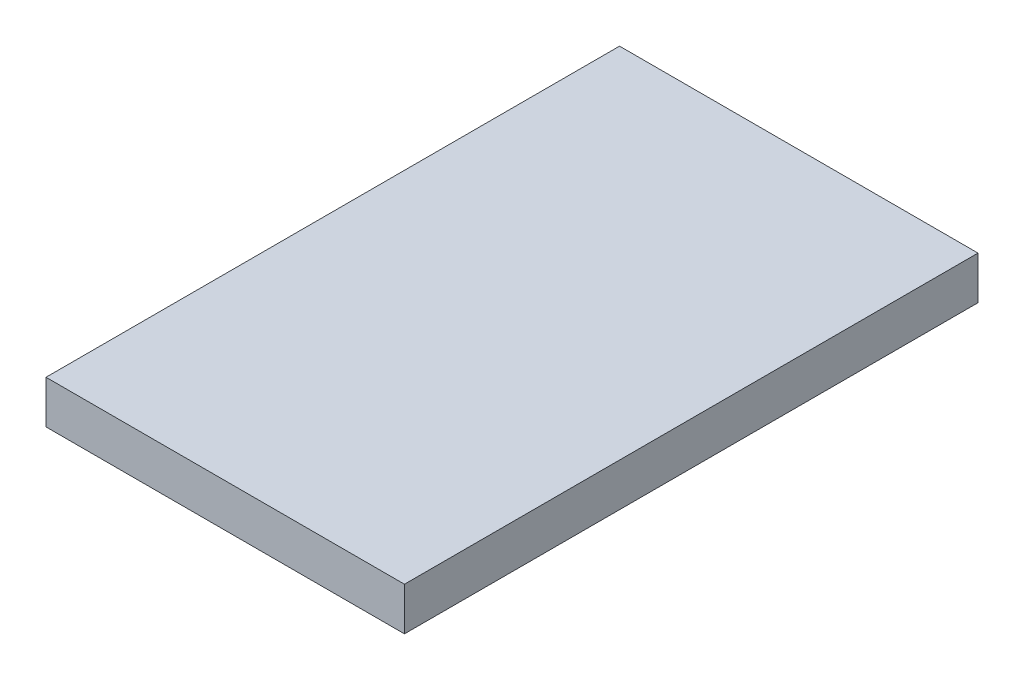
ISO-10303-21;
HEADER;
FILE_DESCRIPTION(('STEP AP214'),'2;1');
FILE_NAME('part.step','',(''),(''),'','','');
FILE_SCHEMA(('AUTOMOTIVE_DESIGN { 1 0 10303 214 1 1 1 1 }'));
ENDSEC;
DATA;
#1=APPLICATION_CONTEXT('core data for automotive mechanical design processes');
#2=APPLICATION_PROTOCOL_DEFINITION('international standard','automotive_design',2000,#1);
#3=PRODUCT_CONTEXT('',#1,'mechanical');
#4=PRODUCT('Part','Part','',(#3));
#5=PRODUCT_RELATED_PRODUCT_CATEGORY('part','',(#4));
#6=PRODUCT_DEFINITION_FORMATION('','',#4);
#7=PRODUCT_DEFINITION_CONTEXT('part definition',#1,'design');
#8=PRODUCT_DEFINITION('design','',#6,#7);
#9=PRODUCT_DEFINITION_SHAPE('','',#8);
#10=(LENGTH_UNIT() NAMED_UNIT(*) SI_UNIT(.MILLI.,.METRE.));
#11=(NAMED_UNIT(*) PLANE_ANGLE_UNIT() SI_UNIT($,.RADIAN.));
#12=(NAMED_UNIT(*) SI_UNIT($,.STERADIAN.) SOLID_ANGLE_UNIT());
#13=UNCERTAINTY_MEASURE_WITH_UNIT(LENGTH_MEASURE(1.E-05),#10,'distance_accuracy_value','');
#14=(GEOMETRIC_REPRESENTATION_CONTEXT(3) GLOBAL_UNCERTAINTY_ASSIGNED_CONTEXT((#13)) GLOBAL_UNIT_ASSIGNED_CONTEXT((#10,
#11,#12)) REPRESENTATION_CONTEXT('',''));
#15=CARTESIAN_POINT('',(0.,0.,0.));
#16=DIRECTION('',(0.,0.,1.));
#17=DIRECTION('',(1.,0.,0.));
#18=AXIS2_PLACEMENT_3D('',#15,#16,#17);
#19=CARTESIAN_POINT('',(12.5,3.,-20.));
#20=DIRECTION('',(-1.,0.,0.));
#21=DIRECTION('',(0.,0.,1.));
#22=AXIS2_PLACEMENT_3D('',#19,#20,#21);
#23=PLANE('',#22);
#24=DIRECTION('',(0.,0.,-1.));
#25=VECTOR('',#24,1.);
#26=CARTESIAN_POINT('',(12.5,0.,-20.));
#27=LINE('',#26,#25);
#28=CARTESIAN_POINT('',(12.5,0.,20.));
#29=VERTEX_POINT('',#28);
#30=CARTESIAN_POINT('',(12.5,0.,-20.));
#31=VERTEX_POINT('',#30);
#32=EDGE_CURVE('E96',#29,#31,#27,.T.);
#33=ORIENTED_EDGE('',*,*,#32,.T.);
#34=DIRECTION('',(0.,-1.,0.));
#35=VECTOR('',#34,1.);
#36=CARTESIAN_POINT('',(12.5,3.,-20.));
#37=LINE('',#36,#35);
#38=CARTESIAN_POINT('',(12.5,3.,-20.));
#39=VERTEX_POINT('',#38);
#40=EDGE_CURVE('E11',#39,#31,#37,.T.);
#41=ORIENTED_EDGE('',*,*,#40,.F.);
#42=DIRECTION('',(0.,0.,-1.));
#43=VECTOR('',#42,1.);
#44=CARTESIAN_POINT('',(12.5,3.,-20.));
#45=LINE('',#44,#43);
#46=CARTESIAN_POINT('',(12.5,3.,20.));
#47=VERTEX_POINT('',#46);
#48=EDGE_CURVE('E84',#47,#39,#45,.T.);
#49=ORIENTED_EDGE('',*,*,#48,.F.);
#50=DIRECTION('',(0.,-1.,0.));
#51=VECTOR('',#50,1.);
#52=CARTESIAN_POINT('',(12.5,3.,20.));
#53=LINE('',#52,#51);
#54=EDGE_CURVE('E92',#47,#29,#53,.T.);
#55=ORIENTED_EDGE('',*,*,#54,.T.);
#56=EDGE_LOOP('',(#33,#41,#49,#55));
#57=FACE_BOUND('',#56,.T.);
#58=ADVANCED_FACE('F33',(#57),#23,.F.);
#59=CARTESIAN_POINT('',(-12.5,3.,-20.));
#60=DIRECTION('',(0.,0.,1.));
#61=DIRECTION('',(1.,0.,0.));
#62=AXIS2_PLACEMENT_3D('',#59,#60,#61);
#63=PLANE('',#62);
#64=DIRECTION('',(-1.,0.,0.));
#65=VECTOR('',#64,1.);
#66=CARTESIAN_POINT('',(-12.5,0.,-20.));
#67=LINE('',#66,#65);
#68=CARTESIAN_POINT('',(-12.5,0.,-20.));
#69=VERTEX_POINT('',#68);
#70=EDGE_CURVE('E88',#31,#69,#67,.T.);
#71=ORIENTED_EDGE('',*,*,#70,.T.);
#72=DIRECTION('',(0.,-1.,0.));
#73=VECTOR('',#72,1.);
#74=CARTESIAN_POINT('',(-12.5,3.,-20.));
#75=LINE('',#74,#73);
#76=CARTESIAN_POINT('',(-12.5,3.,-20.));
#77=VERTEX_POINT('',#76);
#78=EDGE_CURVE('E41',#77,#69,#75,.T.);
#79=ORIENTED_EDGE('',*,*,#78,.F.);
#80=DIRECTION('',(-1.,0.,0.));
#81=VECTOR('',#80,1.);
#82=CARTESIAN_POINT('',(-12.5,3.,-20.));
#83=LINE('',#82,#81);
#84=EDGE_CURVE('E79',#39,#77,#83,.T.);
#85=ORIENTED_EDGE('',*,*,#84,.F.);
#86=ORIENTED_EDGE('',*,*,#40,.T.);
#87=EDGE_LOOP('',(#71,#79,#85,#86));
#88=FACE_BOUND('',#87,.T.);
#89=ADVANCED_FACE('F87',(#88),#63,.F.);
#90=CARTESIAN_POINT('',(-12.5,3.,-20.));
#91=DIRECTION('',(1.,0.,0.));
#92=DIRECTION('',(0.,0.,-1.));
#93=AXIS2_PLACEMENT_3D('',#90,#91,#92);
#94=PLANE('',#93);
#95=DIRECTION('',(0.,0.,1.));
#96=VECTOR('',#95,1.);
#97=CARTESIAN_POINT('',(-12.5,0.,-20.));
#98=LINE('',#97,#96);
#99=CARTESIAN_POINT('',(-12.5,0.,20.));
#100=VERTEX_POINT('',#99);
#101=EDGE_CURVE('E66',#69,#100,#98,.T.);
#102=ORIENTED_EDGE('',*,*,#101,.T.);
#103=DIRECTION('',(0.,-1.,0.));
#104=VECTOR('',#103,1.);
#105=CARTESIAN_POINT('',(-12.5,3.,20.));
#106=LINE('',#105,#104);
#107=CARTESIAN_POINT('',(-12.5,3.,20.));
#108=VERTEX_POINT('',#107);
#109=EDGE_CURVE('E89',#108,#100,#106,.T.);
#110=ORIENTED_EDGE('',*,*,#109,.F.);
#111=DIRECTION('',(0.,0.,1.));
#112=VECTOR('',#111,1.);
#113=CARTESIAN_POINT('',(-12.5,3.,-20.));
#114=LINE('',#113,#112);
#115=EDGE_CURVE('E82',#77,#108,#114,.T.);
#116=ORIENTED_EDGE('',*,*,#115,.F.);
#117=ORIENTED_EDGE('',*,*,#78,.T.);
#118=EDGE_LOOP('',(#102,#110,#116,#117));
#119=FACE_BOUND('',#118,.T.);
#120=ADVANCED_FACE('F90',(#119),#94,.F.);
#121=CARTESIAN_POINT('',(-12.5,3.,20.));
#122=DIRECTION('',(0.,0.,-1.));
#123=DIRECTION('',(-1.,0.,0.));
#124=AXIS2_PLACEMENT_3D('',#121,#122,#123);
#125=PLANE('',#124);
#126=DIRECTION('',(1.,0.,0.));
#127=VECTOR('',#126,1.);
#128=CARTESIAN_POINT('',(-12.5,0.,20.));
#129=LINE('',#128,#127);
#130=EDGE_CURVE('E72',#100,#29,#129,.T.);
#131=ORIENTED_EDGE('',*,*,#130,.T.);
#132=ORIENTED_EDGE('',*,*,#54,.F.);
#133=DIRECTION('',(1.,0.,0.));
#134=VECTOR('',#133,1.);
#135=CARTESIAN_POINT('',(-12.5,3.,20.));
#136=LINE('',#135,#134);
#137=EDGE_CURVE('E49',#108,#47,#136,.T.);
#138=ORIENTED_EDGE('',*,*,#137,.F.);
#139=ORIENTED_EDGE('',*,*,#109,.T.);
#140=EDGE_LOOP('',(#131,#132,#138,#139));
#141=FACE_BOUND('',#140,.T.);
#142=ADVANCED_FACE('F103',(#141),#125,.F.);
#143=CARTESIAN_POINT('',(0.,3.,0.));
#144=DIRECTION('',(0.,1.,0.));
#145=DIRECTION('',(0.,0.,1.));
#146=AXIS2_PLACEMENT_3D('',#143,#144,#145);
#147=PLANE('',#146);
#148=ORIENTED_EDGE('',*,*,#48,.T.);
#149=ORIENTED_EDGE('',*,*,#84,.T.);
#150=ORIENTED_EDGE('',*,*,#115,.T.);
#151=ORIENTED_EDGE('',*,*,#137,.T.);
#152=EDGE_LOOP('',(#148,#149,#150,#151));
#153=FACE_BOUND('',#152,.T.);
#154=ADVANCED_FACE('F80',(#153),#147,.T.);
#155=CARTESIAN_POINT('',(0.,0.,0.));
#156=DIRECTION('',(0.,1.,0.));
#157=DIRECTION('',(0.,0.,1.));
#158=AXIS2_PLACEMENT_3D('',#155,#156,#157);
#159=PLANE('',#158);
#160=ORIENTED_EDGE('',*,*,#32,.F.);
#161=ORIENTED_EDGE('',*,*,#130,.F.);
#162=ORIENTED_EDGE('',*,*,#101,.F.);
#163=ORIENTED_EDGE('',*,*,#70,.F.);
#164=EDGE_LOOP('',(#160,#161,#162,#163));
#165=FACE_BOUND('',#164,.T.);
#166=ADVANCED_FACE('F106',(#165),#159,.F.);
#167=CLOSED_SHELL('',(#58,#89,#120,#142,#154,#166));
#168=MANIFOLD_SOLID_BREP('B2',#167);
#169=ADVANCED_BREP_SHAPE_REPRESENTATION('',(#18,#168),#14);
#170=SHAPE_DEFINITION_REPRESENTATION(#9,#169);
ENDSEC;
END-ISO-10303-21;
